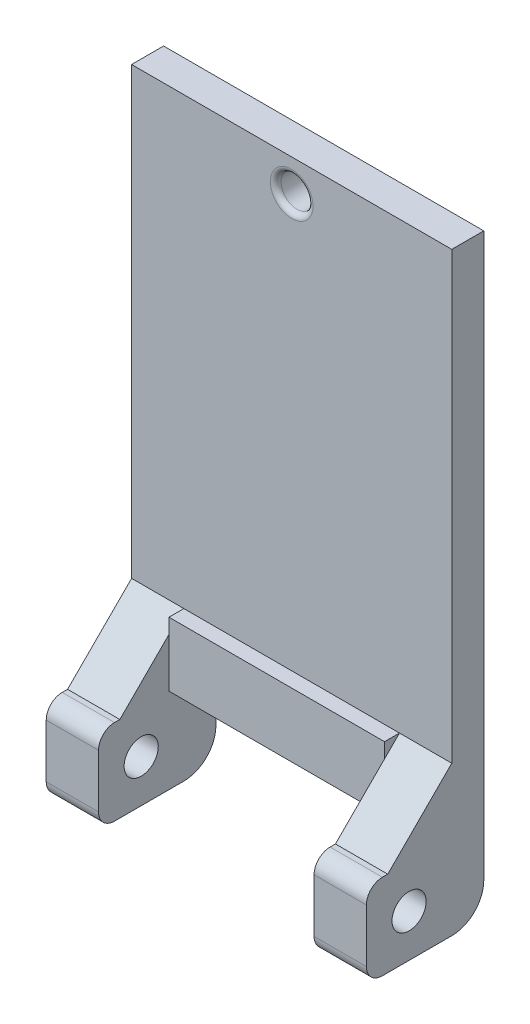
ISO-10303-21;
HEADER;
FILE_DESCRIPTION(('STEP AP214'),'2;1');
FILE_NAME('part.step','',(''),(''),'','','');
FILE_SCHEMA(('AUTOMOTIVE_DESIGN { 1 0 10303 214 1 1 1 1 }'));
ENDSEC;
DATA;
#1=APPLICATION_CONTEXT('core data for automotive mechanical design processes');
#2=APPLICATION_PROTOCOL_DEFINITION('international standard','automotive_design',2000,#1);
#3=PRODUCT_CONTEXT('',#1,'mechanical');
#4=PRODUCT('Part','Part','',(#3));
#5=PRODUCT_RELATED_PRODUCT_CATEGORY('part','',(#4));
#6=PRODUCT_DEFINITION_FORMATION('','',#4);
#7=PRODUCT_DEFINITION_CONTEXT('part definition',#1,'design');
#8=PRODUCT_DEFINITION('design','',#6,#7);
#9=PRODUCT_DEFINITION_SHAPE('','',#8);
#10=(LENGTH_UNIT() NAMED_UNIT(*) SI_UNIT(.MILLI.,.METRE.));
#11=(NAMED_UNIT(*) PLANE_ANGLE_UNIT() SI_UNIT($,.RADIAN.));
#12=(NAMED_UNIT(*) SI_UNIT($,.STERADIAN.) SOLID_ANGLE_UNIT());
#13=UNCERTAINTY_MEASURE_WITH_UNIT(LENGTH_MEASURE(1.E-05),#10,'distance_accuracy_value','');
#14=(GEOMETRIC_REPRESENTATION_CONTEXT(3) GLOBAL_UNCERTAINTY_ASSIGNED_CONTEXT((#13)) GLOBAL_UNIT_ASSIGNED_CONTEXT((#10,
#11,#12)) REPRESENTATION_CONTEXT('',''));
#15=CARTESIAN_POINT('',(0.,0.,0.));
#16=DIRECTION('',(0.,0.,1.));
#17=DIRECTION('',(1.,0.,0.));
#18=AXIS2_PLACEMENT_3D('',#15,#16,#17);
#19=CARTESIAN_POINT('',(0.,0.,3.));
#20=DIRECTION('',(0.,0.,-1.));
#21=DIRECTION('',(-1.,0.,0.));
#22=AXIS2_PLACEMENT_3D('',#19,#20,#21);
#23=PLANE('',#22);
#24=CARTESIAN_POINT('',(0.,24.85,3.));
#25=DIRECTION('',(0.,0.,-1.));
#26=DIRECTION('',(-1.,0.,0.));
#27=AXIS2_PLACEMENT_3D('',#24,#25,#26);
#28=CIRCLE('',#27,2.);
#29=CARTESIAN_POINT('',(-2.,24.85,3.));
#30=VERTEX_POINT('',#29);
#31=EDGE_CURVE('E295',#30,#30,#28,.T.);
#32=ORIENTED_EDGE('',*,*,#31,.T.);
#33=EDGE_LOOP('',(#32));
#34=FACE_BOUND('',#33,.T.);
#35=DIRECTION('',(-1.,0.,0.));
#36=VECTOR('',#35,1.);
#37=CARTESIAN_POINT('',(-10.1,-13.85,3.));
#38=LINE('',#37,#36);
#39=CARTESIAN_POINT('',(10.1,-13.85,3.));
#40=VERTEX_POINT('',#39);
#41=CARTESIAN_POINT('',(-10.1,-13.85,3.));
#42=VERTEX_POINT('',#41);
#43=EDGE_CURVE('E209',#40,#42,#38,.T.);
#44=ORIENTED_EDGE('',*,*,#43,.F.);
#45=DIRECTION('',(1.,0.,0.));
#46=VECTOR('',#45,1.);
#47=CARTESIAN_POINT('',(0.,-13.85,3.));
#48=LINE('',#47,#46);
#49=CARTESIAN_POINT('',(15.,-13.85,3.));
#50=VERTEX_POINT('',#49);
#51=EDGE_CURVE('E358',#40,#50,#48,.T.);
#52=ORIENTED_EDGE('',*,*,#51,.T.);
#53=DIRECTION('',(0.,1.,0.));
#54=VECTOR('',#53,1.);
#55=CARTESIAN_POINT('',(15.,-27.85,3.));
#56=LINE('',#55,#54);
#57=CARTESIAN_POINT('',(15.,27.85,3.));
#58=VERTEX_POINT('',#57);
#59=EDGE_CURVE('E259',#50,#58,#56,.T.);
#60=ORIENTED_EDGE('',*,*,#59,.T.);
#61=DIRECTION('',(-1.,0.,0.));
#62=VECTOR('',#61,1.);
#63=CARTESIAN_POINT('',(-15.,27.85,3.));
#64=LINE('',#63,#62);
#65=CARTESIAN_POINT('',(-15.,27.85,3.));
#66=VERTEX_POINT('',#65);
#67=EDGE_CURVE('E261',#58,#66,#64,.T.);
#68=ORIENTED_EDGE('',*,*,#67,.T.);
#69=DIRECTION('',(0.,-1.,0.));
#70=VECTOR('',#69,1.);
#71=CARTESIAN_POINT('',(-15.,-27.85,3.));
#72=LINE('',#71,#70);
#73=CARTESIAN_POINT('',(-15.,-13.85,3.));
#74=VERTEX_POINT('',#73);
#75=EDGE_CURVE('E264',#66,#74,#72,.T.);
#76=ORIENTED_EDGE('',*,*,#75,.T.);
#77=DIRECTION('',(1.,0.,0.));
#78=VECTOR('',#77,1.);
#79=CARTESIAN_POINT('',(-10.1,-13.85,3.));
#80=LINE('',#79,#78);
#81=EDGE_CURVE('E361',#74,#42,#80,.T.);
#82=ORIENTED_EDGE('',*,*,#81,.T.);
#83=EDGE_LOOP('',(#44,#52,#60,#68,#76,#82));
#84=FACE_BOUND('',#83,.T.);
#85=ADVANCED_FACE('F32',(#34,#84),#23,.F.);
#86=CARTESIAN_POINT('',(-10.1,-27.85,11.));
#87=DIRECTION('',(-1.,0.,0.));
#88=DIRECTION('',(0.,-1.,0.));
#89=AXIS2_PLACEMENT_3D('',#86,#87,#88);
#90=PLANE('',#89);
#91=CARTESIAN_POINT('',(-10.1,-23.85,7.));
#92=DIRECTION('',(-1.,0.,0.));
#93=DIRECTION('',(0.,-1.,0.));
#94=AXIS2_PLACEMENT_3D('',#91,#92,#93);
#95=CIRCLE('',#94,1.6);
#96=CARTESIAN_POINT('',(-10.1,-25.45,7.));
#97=VERTEX_POINT('',#96);
#98=EDGE_CURVE('E243',#97,#97,#95,.T.);
#99=ORIENTED_EDGE('',*,*,#98,.T.);
#100=EDGE_LOOP('',(#99));
#101=FACE_BOUND('',#100,.T.);
#102=DIRECTION('',(0.,0.,-1.));
#103=VECTOR('',#102,1.);
#104=CARTESIAN_POINT('',(-10.1,-19.85,11.));
#105=LINE('',#104,#103);
#106=CARTESIAN_POINT('',(-10.1,-19.85,4.4));
#107=VERTEX_POINT('',#106);
#108=CARTESIAN_POINT('',(-10.1,-19.85,0.));
#109=VERTEX_POINT('',#108);
#110=EDGE_CURVE('E47',#107,#109,#105,.T.);
#111=ORIENTED_EDGE('',*,*,#110,.F.);
#112=DIRECTION('',(0.,-1.,0.));
#113=VECTOR('',#112,1.);
#114=CARTESIAN_POINT('',(-10.1,-13.85,4.4));
#115=LINE('',#114,#113);
#116=CARTESIAN_POINT('',(-10.1,-15.25,4.4));
#117=VERTEX_POINT('',#116);
#118=EDGE_CURVE('E210',#117,#107,#115,.T.);
#119=ORIENTED_EDGE('',*,*,#118,.F.);
#120=DIRECTION('',(0.,0.707106781186544,-0.707106781186551));
#121=VECTOR('',#120,1.);
#122=CARTESIAN_POINT('',(-10.1,-24.8499999999999,14.));
#123=LINE('',#122,#121);
#124=CARTESIAN_POINT('',(-10.1,-19.85,9.00000000000004));
#125=VERTEX_POINT('',#124);
#126=EDGE_CURVE('E367',#117,#125,#123,.F.);
#127=ORIENTED_EDGE('',*,*,#126,.T.);
#128=DIRECTION('',(0.,0.,-1.));
#129=VECTOR('',#128,1.);
#130=CARTESIAN_POINT('',(-10.1,-19.85,11.));
#131=LINE('',#130,#129);
#132=CARTESIAN_POINT('',(-10.1,-19.85,9.5));
#133=VERTEX_POINT('',#132);
#134=EDGE_CURVE('E253',#133,#125,#131,.T.);
#135=ORIENTED_EDGE('',*,*,#134,.F.);
#136=CARTESIAN_POINT('',(-10.1,-21.35,9.5));
#137=DIRECTION('',(-1.,0.,0.));
#138=DIRECTION('',(0.,-1.,0.));
#139=AXIS2_PLACEMENT_3D('',#136,#137,#138);
#140=CIRCLE('',#139,1.5);
#141=CARTESIAN_POINT('',(-10.1,-21.35,11.));
#142=VERTEX_POINT('',#141);
#143=EDGE_CURVE('E343',#133,#142,#140,.F.);
#144=ORIENTED_EDGE('',*,*,#143,.T.);
#145=DIRECTION('',(0.,1.,0.));
#146=VECTOR('',#145,1.);
#147=CARTESIAN_POINT('',(-10.1,-27.85,11.));
#148=LINE('',#147,#146);
#149=CARTESIAN_POINT('',(-10.1,-26.35,11.));
#150=VERTEX_POINT('',#149);
#151=EDGE_CURVE('E247',#150,#142,#148,.T.);
#152=ORIENTED_EDGE('',*,*,#151,.F.);
#153=CARTESIAN_POINT('',(-10.1,-26.35,9.5));
#154=DIRECTION('',(-1.,0.,0.));
#155=DIRECTION('',(0.,-1.,0.));
#156=AXIS2_PLACEMENT_3D('',#153,#154,#155);
#157=CIRCLE('',#156,1.5);
#158=CARTESIAN_POINT('',(-10.1,-27.85,9.5));
#159=VERTEX_POINT('',#158);
#160=EDGE_CURVE('E345',#150,#159,#157,.F.);
#161=ORIENTED_EDGE('',*,*,#160,.T.);
#162=DIRECTION('',(0.,0.,-1.));
#163=VECTOR('',#162,1.);
#164=CARTESIAN_POINT('',(-10.1,-27.85,11.));
#165=LINE('',#164,#163);
#166=CARTESIAN_POINT('',(-10.1,-27.85,3.));
#167=VERTEX_POINT('',#166);
#168=EDGE_CURVE('E256',#159,#167,#165,.T.);
#169=ORIENTED_EDGE('',*,*,#168,.T.);
#170=CARTESIAN_POINT('',(-10.1,-24.85,3.));
#171=DIRECTION('',(1.,0.,0.));
#172=DIRECTION('',(0.,1.,0.));
#173=AXIS2_PLACEMENT_3D('',#170,#171,#172);
#174=CIRCLE('',#173,3.);
#175=CARTESIAN_POINT('',(-10.1,-24.85,0.));
#176=VERTEX_POINT('',#175);
#177=EDGE_CURVE('E316',#176,#167,#174,.F.);
#178=ORIENTED_EDGE('',*,*,#177,.F.);
#179=DIRECTION('',(0.,-1.,0.));
#180=VECTOR('',#179,1.);
#181=CARTESIAN_POINT('',(-10.1,0.,0.));
#182=LINE('',#181,#180);
#183=EDGE_CURVE('E217',#109,#176,#182,.T.);
#184=ORIENTED_EDGE('',*,*,#183,.F.);
#185=EDGE_LOOP('',(#111,#119,#127,#135,#144,#152,#161,#169,#178,#184));
#186=FACE_BOUND('',#185,.T.);
#187=ADVANCED_FACE('F447',(#101,#186),#90,.F.);
#188=CARTESIAN_POINT('',(10.1,-27.85,11.));
#189=DIRECTION('',(-1.,0.,0.));
#190=DIRECTION('',(0.,-1.,0.));
#191=AXIS2_PLACEMENT_3D('',#188,#189,#190);
#192=PLANE('',#191);
#193=CARTESIAN_POINT('',(10.1,-23.85,7.));
#194=DIRECTION('',(-1.,0.,0.));
#195=DIRECTION('',(0.,-1.,0.));
#196=AXIS2_PLACEMENT_3D('',#193,#194,#195);
#197=CIRCLE('',#196,1.6);
#198=CARTESIAN_POINT('',(10.1,-25.45,7.));
#199=VERTEX_POINT('',#198);
#200=EDGE_CURVE('E225',#199,#199,#197,.F.);
#201=ORIENTED_EDGE('',*,*,#200,.T.);
#202=EDGE_LOOP('',(#201));
#203=FACE_BOUND('',#202,.T.);
#204=DIRECTION('',(0.,1.,0.));
#205=VECTOR('',#204,1.);
#206=CARTESIAN_POINT('',(10.1,-19.85,4.4));
#207=LINE('',#206,#205);
#208=CARTESIAN_POINT('',(10.1,-19.85,4.4));
#209=VERTEX_POINT('',#208);
#210=CARTESIAN_POINT('',(10.1,-15.25,4.4));
#211=VERTEX_POINT('',#210);
#212=EDGE_CURVE('E190',#209,#211,#207,.T.);
#213=ORIENTED_EDGE('',*,*,#212,.F.);
#214=DIRECTION('',(0.,0.,-1.));
#215=VECTOR('',#214,1.);
#216=CARTESIAN_POINT('',(10.1,-19.85,11.));
#217=LINE('',#216,#215);
#218=CARTESIAN_POINT('',(10.1,-19.85,0.));
#219=VERTEX_POINT('',#218);
#220=EDGE_CURVE('E55',#209,#219,#217,.T.);
#221=ORIENTED_EDGE('',*,*,#220,.T.);
#222=DIRECTION('',(0.,1.,0.));
#223=VECTOR('',#222,1.);
#224=CARTESIAN_POINT('',(10.1,0.,0.));
#225=LINE('',#224,#223);
#226=CARTESIAN_POINT('',(10.1,-24.85,0.));
#227=VERTEX_POINT('',#226);
#228=EDGE_CURVE('E214',#227,#219,#225,.T.);
#229=ORIENTED_EDGE('',*,*,#228,.F.);
#230=CARTESIAN_POINT('',(10.1,-24.85,3.));
#231=DIRECTION('',(-1.,0.,0.));
#232=DIRECTION('',(0.,-1.,0.));
#233=AXIS2_PLACEMENT_3D('',#230,#231,#232);
#234=CIRCLE('',#233,3.);
#235=CARTESIAN_POINT('',(10.1,-27.85,3.));
#236=VERTEX_POINT('',#235);
#237=EDGE_CURVE('E313',#236,#227,#234,.F.);
#238=ORIENTED_EDGE('',*,*,#237,.F.);
#239=DIRECTION('',(0.,0.,-1.));
#240=VECTOR('',#239,1.);
#241=CARTESIAN_POINT('',(10.1,-27.85,11.));
#242=LINE('',#241,#240);
#243=CARTESIAN_POINT('',(10.1,-27.85,9.5));
#244=VERTEX_POINT('',#243);
#245=EDGE_CURVE('E232',#244,#236,#242,.T.);
#246=ORIENTED_EDGE('',*,*,#245,.F.);
#247=CARTESIAN_POINT('',(10.1,-26.35,9.5));
#248=DIRECTION('',(-1.,0.,0.));
#249=DIRECTION('',(0.,-1.,0.));
#250=AXIS2_PLACEMENT_3D('',#247,#248,#249);
#251=CIRCLE('',#250,1.5);
#252=CARTESIAN_POINT('',(10.1,-26.35,11.));
#253=VERTEX_POINT('',#252);
#254=EDGE_CURVE('E324',#244,#253,#251,.T.);
#255=ORIENTED_EDGE('',*,*,#254,.T.);
#256=DIRECTION('',(0.,1.,0.));
#257=VECTOR('',#256,1.);
#258=CARTESIAN_POINT('',(10.1,-27.85,11.));
#259=LINE('',#258,#257);
#260=CARTESIAN_POINT('',(10.1,-21.35,11.));
#261=VERTEX_POINT('',#260);
#262=EDGE_CURVE('E229',#253,#261,#259,.T.);
#263=ORIENTED_EDGE('',*,*,#262,.T.);
#264=CARTESIAN_POINT('',(10.1,-21.35,9.5));
#265=DIRECTION('',(-1.,0.,0.));
#266=DIRECTION('',(0.,-1.,0.));
#267=AXIS2_PLACEMENT_3D('',#264,#265,#266);
#268=CIRCLE('',#267,1.5);
#269=CARTESIAN_POINT('',(10.1,-19.85,9.5));
#270=VERTEX_POINT('',#269);
#271=EDGE_CURVE('E322',#261,#270,#268,.T.);
#272=ORIENTED_EDGE('',*,*,#271,.T.);
#273=DIRECTION('',(0.,0.,-1.));
#274=VECTOR('',#273,1.);
#275=CARTESIAN_POINT('',(10.1,-19.85,11.));
#276=LINE('',#275,#274);
#277=CARTESIAN_POINT('',(10.1,-19.85,8.99999999999997));
#278=VERTEX_POINT('',#277);
#279=EDGE_CURVE('E234',#270,#278,#276,.T.);
#280=ORIENTED_EDGE('',*,*,#279,.T.);
#281=DIRECTION('',(0.,0.707106781186551,-0.707106781186544));
#282=VECTOR('',#281,1.);
#283=CARTESIAN_POINT('',(10.1,-13.85,3.));
#284=LINE('',#283,#282);
#285=EDGE_CURVE('E11',#278,#211,#284,.T.);
#286=ORIENTED_EDGE('',*,*,#285,.T.);
#287=EDGE_LOOP('',(#213,#221,#229,#238,#246,#255,#263,#272,#280,#286));
#288=FACE_BOUND('',#287,.T.);
#289=ADVANCED_FACE('F384',(#203,#288),#192,.T.);
#290=CARTESIAN_POINT('',(0.,0.,0.));
#291=DIRECTION('',(0.,0.,-1.));
#292=DIRECTION('',(-1.,0.,0.));
#293=AXIS2_PLACEMENT_3D('',#290,#291,#292);
#294=PLANE('',#293);
#295=CARTESIAN_POINT('',(0.,24.85,0.));
#296=DIRECTION('',(0.,0.,-1.));
#297=DIRECTION('',(-1.,0.,0.));
#298=AXIS2_PLACEMENT_3D('',#295,#296,#297);
#299=CIRCLE('',#298,2.);
#300=CARTESIAN_POINT('',(-2.,24.85,0.));
#301=VERTEX_POINT('',#300);
#302=EDGE_CURVE('E292',#301,#301,#299,.F.);
#303=ORIENTED_EDGE('',*,*,#302,.T.);
#304=EDGE_LOOP('',(#303));
#305=FACE_BOUND('',#304,.T.);
#306=DIRECTION('',(1.,0.,0.));
#307=VECTOR('',#306,1.);
#308=CARTESIAN_POINT('',(0.,-19.85,0.));
#309=LINE('',#308,#307);
#310=EDGE_CURVE('E220',#109,#219,#309,.T.);
#311=ORIENTED_EDGE('',*,*,#310,.F.);
#312=ORIENTED_EDGE('',*,*,#183,.T.);
#313=DIRECTION('',(1.,0.,0.));
#314=VECTOR('',#313,1.);
#315=CARTESIAN_POINT('',(-15.,-24.85,0.));
#316=LINE('',#315,#314);
#317=CARTESIAN_POINT('',(-15.,-24.85,0.));
#318=VERTEX_POINT('',#317);
#319=EDGE_CURVE('E306',#176,#318,#316,.F.);
#320=ORIENTED_EDGE('',*,*,#319,.T.);
#321=DIRECTION('',(0.,-1.,0.));
#322=VECTOR('',#321,1.);
#323=CARTESIAN_POINT('',(-15.,-27.85,0.));
#324=LINE('',#323,#322);
#325=CARTESIAN_POINT('',(-15.,27.85,0.));
#326=VERTEX_POINT('',#325);
#327=EDGE_CURVE('E262',#326,#318,#324,.T.);
#328=ORIENTED_EDGE('',*,*,#327,.F.);
#329=DIRECTION('',(-1.,0.,0.));
#330=VECTOR('',#329,1.);
#331=CARTESIAN_POINT('',(-15.,27.85,0.));
#332=LINE('',#331,#330);
#333=CARTESIAN_POINT('',(15.,27.85,0.));
#334=VERTEX_POINT('',#333);
#335=EDGE_CURVE('E269',#334,#326,#332,.T.);
#336=ORIENTED_EDGE('',*,*,#335,.F.);
#337=DIRECTION('',(0.,1.,0.));
#338=VECTOR('',#337,1.);
#339=CARTESIAN_POINT('',(15.,-27.85,0.));
#340=LINE('',#339,#338);
#341=CARTESIAN_POINT('',(15.,-24.85,0.));
#342=VERTEX_POINT('',#341);
#343=EDGE_CURVE('E258',#342,#334,#340,.T.);
#344=ORIENTED_EDGE('',*,*,#343,.F.);
#345=EDGE_CURVE('E307',#342,#227,#316,.F.);
#346=ORIENTED_EDGE('',*,*,#345,.T.);
#347=ORIENTED_EDGE('',*,*,#228,.T.);
#348=EDGE_LOOP('',(#311,#312,#320,#328,#336,#344,#346,#347));
#349=FACE_BOUND('',#348,.T.);
#350=ADVANCED_FACE('F412',(#305,#349),#294,.T.);
#351=CARTESIAN_POINT('',(-15.,-24.85,3.));
#352=DIRECTION('',(-1.,0.,0.));
#353=DIRECTION('',(0.,0.,1.));
#354=AXIS2_PLACEMENT_3D('',#351,#352,#353);
#355=CYLINDRICAL_SURFACE('',#354,3.);
#356=ORIENTED_EDGE('',*,*,#319,.F.);
#357=ORIENTED_EDGE('',*,*,#177,.T.);
#358=DIRECTION('',(1.,0.,0.));
#359=VECTOR('',#358,1.);
#360=CARTESIAN_POINT('',(15.,-27.85,3.));
#361=LINE('',#360,#359);
#362=CARTESIAN_POINT('',(-15.,-27.85,3.));
#363=VERTEX_POINT('',#362);
#364=EDGE_CURVE('E301',#363,#167,#361,.T.);
#365=ORIENTED_EDGE('',*,*,#364,.F.);
#366=CARTESIAN_POINT('',(-15.,-24.85,3.));
#367=DIRECTION('',(1.,0.,0.));
#368=DIRECTION('',(0.,0.,-1.));
#369=AXIS2_PLACEMENT_3D('',#366,#367,#368);
#370=CIRCLE('',#369,3.);
#371=EDGE_CURVE('E310',#318,#363,#370,.F.);
#372=ORIENTED_EDGE('',*,*,#371,.F.);
#373=EDGE_LOOP('',(#356,#357,#365,#372));
#374=FACE_BOUND('',#373,.T.);
#375=ADVANCED_FACE('F432',(#374),#355,.T.);
#376=DIRECTION('',(1.,0.,0.));
#377=VECTOR('',#376,1.);
#378=CARTESIAN_POINT('',(15.,-27.85,3.));
#379=LINE('',#378,#377);
#380=CARTESIAN_POINT('',(15.,-27.85,3.));
#381=VERTEX_POINT('',#380);
#382=EDGE_CURVE('E298',#236,#381,#379,.T.);
#383=ORIENTED_EDGE('',*,*,#382,.F.);
#384=ORIENTED_EDGE('',*,*,#237,.T.);
#385=ORIENTED_EDGE('',*,*,#345,.F.);
#386=CARTESIAN_POINT('',(15.,-24.85,3.));
#387=DIRECTION('',(-1.,0.,0.));
#388=DIRECTION('',(0.,0.,1.));
#389=AXIS2_PLACEMENT_3D('',#386,#387,#388);
#390=CIRCLE('',#389,3.);
#391=EDGE_CURVE('E304',#381,#342,#390,.F.);
#392=ORIENTED_EDGE('',*,*,#391,.F.);
#393=EDGE_LOOP('',(#383,#384,#385,#392));
#394=FACE_BOUND('',#393,.T.);
#395=ADVANCED_FACE('F407',(#394),#355,.T.);
#396=CARTESIAN_POINT('',(-15.,-27.85,3.));
#397=DIRECTION('',(0.,1.,0.));
#398=DIRECTION('',(0.,0.,1.));
#399=AXIS2_PLACEMENT_3D('',#396,#397,#398);
#400=PLANE('',#399);
#401=ORIENTED_EDGE('',*,*,#168,.F.);
#402=DIRECTION('',(1.,0.,0.));
#403=VECTOR('',#402,1.);
#404=CARTESIAN_POINT('',(-15.,-27.85,9.5));
#405=LINE('',#404,#403);
#406=CARTESIAN_POINT('',(-15.,-27.85,9.5));
#407=VERTEX_POINT('',#406);
#408=EDGE_CURVE('E347',#159,#407,#405,.F.);
#409=ORIENTED_EDGE('',*,*,#408,.T.);
#410=DIRECTION('',(0.,0.,-1.));
#411=VECTOR('',#410,1.);
#412=CARTESIAN_POINT('',(-15.,-27.85,3.));
#413=LINE('',#412,#411);
#414=EDGE_CURVE('E274',#407,#363,#413,.T.);
#415=ORIENTED_EDGE('',*,*,#414,.T.);
#416=ORIENTED_EDGE('',*,*,#364,.T.);
#417=EDGE_LOOP('',(#401,#409,#415,#416));
#418=FACE_BOUND('',#417,.T.);
#419=ADVANCED_FACE('F461',(#418),#400,.F.);
#420=CARTESIAN_POINT('',(15.,-27.85,3.));
#421=DIRECTION('',(-1.,0.,0.));
#422=DIRECTION('',(0.,0.,1.));
#423=AXIS2_PLACEMENT_3D('',#420,#421,#422);
#424=PLANE('',#423);
#425=CARTESIAN_POINT('',(15.,-23.85,7.));
#426=DIRECTION('',(-1.,0.,0.));
#427=DIRECTION('',(0.,0.,1.));
#428=AXIS2_PLACEMENT_3D('',#425,#426,#427);
#429=CIRCLE('',#428,1.6);
#430=CARTESIAN_POINT('',(15.,-23.85,8.6));
#431=VERTEX_POINT('',#430);
#432=EDGE_CURVE('E222',#431,#431,#429,.T.);
#433=ORIENTED_EDGE('',*,*,#432,.T.);
#434=EDGE_LOOP('',(#433));
#435=FACE_BOUND('',#434,.T.);
#436=DIRECTION('',(0.,-1.,0.));
#437=VECTOR('',#436,1.);
#438=CARTESIAN_POINT('',(15.,-27.85,11.));
#439=LINE('',#438,#437);
#440=CARTESIAN_POINT('',(15.,-21.35,11.));
#441=VERTEX_POINT('',#440);
#442=CARTESIAN_POINT('',(15.,-26.35,11.));
#443=VERTEX_POINT('',#442);
#444=EDGE_CURVE('E226',#441,#443,#439,.T.);
#445=ORIENTED_EDGE('',*,*,#444,.T.);
#446=CARTESIAN_POINT('',(15.,-26.35,9.5));
#447=DIRECTION('',(-1.,0.,0.));
#448=DIRECTION('',(0.,0.,1.));
#449=AXIS2_PLACEMENT_3D('',#446,#447,#448);
#450=CIRCLE('',#449,1.5);
#451=CARTESIAN_POINT('',(15.,-27.85,9.5));
#452=VERTEX_POINT('',#451);
#453=EDGE_CURVE('E332',#443,#452,#450,.F.);
#454=ORIENTED_EDGE('',*,*,#453,.T.);
#455=DIRECTION('',(0.,0.,-1.));
#456=VECTOR('',#455,1.);
#457=CARTESIAN_POINT('',(15.,-27.85,3.));
#458=LINE('',#457,#456);
#459=EDGE_CURVE('E267',#452,#381,#458,.T.);
#460=ORIENTED_EDGE('',*,*,#459,.T.);
#461=ORIENTED_EDGE('',*,*,#391,.T.);
#462=ORIENTED_EDGE('',*,*,#343,.T.);
#463=DIRECTION('',(0.,0.,-1.));
#464=VECTOR('',#463,1.);
#465=CARTESIAN_POINT('',(15.,27.85,3.));
#466=LINE('',#465,#464);
#467=EDGE_CURVE('E279',#58,#334,#466,.T.);
#468=ORIENTED_EDGE('',*,*,#467,.F.);
#469=ORIENTED_EDGE('',*,*,#59,.F.);
#470=DIRECTION('',(0.,-0.707106781186551,0.707106781186544));
#471=VECTOR('',#470,1.);
#472=CARTESIAN_POINT('',(15.,-20.8500000000001,10.));
#473=LINE('',#472,#471);
#474=CARTESIAN_POINT('',(15.,-19.85,8.99999999999997));
#475=VERTEX_POINT('',#474);
#476=EDGE_CURVE('E370',#50,#475,#473,.T.);
#477=ORIENTED_EDGE('',*,*,#476,.T.);
#478=DIRECTION('',(0.,0.,-1.));
#479=VECTOR('',#478,1.);
#480=CARTESIAN_POINT('',(15.,-19.85,11.));
#481=LINE('',#480,#479);
#482=CARTESIAN_POINT('',(15.,-19.85,9.5));
#483=VERTEX_POINT('',#482);
#484=EDGE_CURVE('E237',#483,#475,#481,.T.);
#485=ORIENTED_EDGE('',*,*,#484,.F.);
#486=CARTESIAN_POINT('',(15.,-21.35,9.5));
#487=DIRECTION('',(-1.,0.,0.));
#488=DIRECTION('',(0.,0.,1.));
#489=AXIS2_PLACEMENT_3D('',#486,#487,#488);
#490=CIRCLE('',#489,1.5);
#491=EDGE_CURVE('E330',#483,#441,#490,.F.);
#492=ORIENTED_EDGE('',*,*,#491,.T.);
#493=EDGE_LOOP('',(#445,#454,#460,#461,#462,#468,#469,#477,#485,#492));
#494=FACE_BOUND('',#493,.T.);
#495=ADVANCED_FACE('F374',(#435,#494),#424,.F.);
#496=CARTESIAN_POINT('',(-15.,27.85,3.));
#497=DIRECTION('',(0.,-1.,0.));
#498=DIRECTION('',(0.,0.,-1.));
#499=AXIS2_PLACEMENT_3D('',#496,#497,#498);
#500=PLANE('',#499);
#501=ORIENTED_EDGE('',*,*,#335,.T.);
#502=DIRECTION('',(0.,0.,-1.));
#503=VECTOR('',#502,1.);
#504=CARTESIAN_POINT('',(-15.,27.85,3.));
#505=LINE('',#504,#503);
#506=EDGE_CURVE('E276',#66,#326,#505,.T.);
#507=ORIENTED_EDGE('',*,*,#506,.F.);
#508=ORIENTED_EDGE('',*,*,#67,.F.);
#509=ORIENTED_EDGE('',*,*,#467,.T.);
#510=EDGE_LOOP('',(#501,#507,#508,#509));
#511=FACE_BOUND('',#510,.T.);
#512=ADVANCED_FACE('F417',(#511),#500,.F.);
#513=CARTESIAN_POINT('',(-15.,-27.85,3.));
#514=DIRECTION('',(1.,0.,0.));
#515=DIRECTION('',(0.,0.,-1.));
#516=AXIS2_PLACEMENT_3D('',#513,#514,#515);
#517=PLANE('',#516);
#518=CARTESIAN_POINT('',(-15.,-23.85,7.));
#519=DIRECTION('',(-1.,0.,0.));
#520=DIRECTION('',(0.,0.,1.));
#521=AXIS2_PLACEMENT_3D('',#518,#519,#520);
#522=CIRCLE('',#521,1.6);
#523=CARTESIAN_POINT('',(-15.,-23.85,8.6));
#524=VERTEX_POINT('',#523);
#525=EDGE_CURVE('E240',#524,#524,#522,.T.);
#526=ORIENTED_EDGE('',*,*,#525,.F.);
#527=EDGE_LOOP('',(#526));
#528=FACE_BOUND('',#527,.T.);
#529=ORIENTED_EDGE('',*,*,#414,.F.);
#530=CARTESIAN_POINT('',(-15.,-26.35,9.5));
#531=DIRECTION('',(1.,0.,0.));
#532=DIRECTION('',(0.,0.,-1.));
#533=AXIS2_PLACEMENT_3D('',#530,#531,#532);
#534=CIRCLE('',#533,1.5);
#535=CARTESIAN_POINT('',(-15.,-26.35,11.));
#536=VERTEX_POINT('',#535);
#537=EDGE_CURVE('E351',#407,#536,#534,.F.);
#538=ORIENTED_EDGE('',*,*,#537,.T.);
#539=DIRECTION('',(0.,-1.,0.));
#540=VECTOR('',#539,1.);
#541=CARTESIAN_POINT('',(-15.,-27.85,11.));
#542=LINE('',#541,#540);
#543=CARTESIAN_POINT('',(-15.,-21.35,11.));
#544=VERTEX_POINT('',#543);
#545=EDGE_CURVE('E244',#544,#536,#542,.T.);
#546=ORIENTED_EDGE('',*,*,#545,.F.);
#547=CARTESIAN_POINT('',(-15.,-21.35,9.5));
#548=DIRECTION('',(1.,0.,0.));
#549=DIRECTION('',(0.,0.,-1.));
#550=AXIS2_PLACEMENT_3D('',#547,#548,#549);
#551=CIRCLE('',#550,1.5);
#552=CARTESIAN_POINT('',(-15.,-19.85,9.5));
#553=VERTEX_POINT('',#552);
#554=EDGE_CURVE('E349',#544,#553,#551,.F.);
#555=ORIENTED_EDGE('',*,*,#554,.T.);
#556=DIRECTION('',(0.,0.,-1.));
#557=VECTOR('',#556,1.);
#558=CARTESIAN_POINT('',(-15.,-19.85,11.));
#559=LINE('',#558,#557);
#560=CARTESIAN_POINT('',(-15.,-19.85,9.00000000000004));
#561=VERTEX_POINT('',#560);
#562=EDGE_CURVE('E250',#553,#561,#559,.T.);
#563=ORIENTED_EDGE('',*,*,#562,.T.);
#564=DIRECTION('',(0.,-0.707106781186544,0.707106781186551));
#565=VECTOR('',#564,1.);
#566=CARTESIAN_POINT('',(-15.,-20.8499999999999,9.99999999999999));
#567=LINE('',#566,#565);
#568=EDGE_CURVE('E365',#561,#74,#567,.F.);
#569=ORIENTED_EDGE('',*,*,#568,.T.);
#570=ORIENTED_EDGE('',*,*,#75,.F.);
#571=ORIENTED_EDGE('',*,*,#506,.T.);
#572=ORIENTED_EDGE('',*,*,#327,.T.);
#573=ORIENTED_EDGE('',*,*,#371,.T.);
#574=EDGE_LOOP('',(#529,#538,#546,#555,#563,#569,#570,#571,#572,#573));
#575=FACE_BOUND('',#574,.T.);
#576=ADVANCED_FACE('F436',(#528,#575),#517,.F.);
#577=ORIENTED_EDGE('',*,*,#459,.F.);
#578=DIRECTION('',(-1.,0.,0.));
#579=VECTOR('',#578,1.);
#580=CARTESIAN_POINT('',(-15.,-27.85,9.5));
#581=LINE('',#580,#579);
#582=EDGE_CURVE('E319',#452,#244,#581,.T.);
#583=ORIENTED_EDGE('',*,*,#582,.T.);
#584=ORIENTED_EDGE('',*,*,#245,.T.);
#585=ORIENTED_EDGE('',*,*,#382,.T.);
#586=EDGE_LOOP('',(#577,#583,#584,#585));
#587=FACE_BOUND('',#586,.T.);
#588=ADVANCED_FACE('F400',(#587),#400,.F.);
#589=CARTESIAN_POINT('',(-15.,-19.85,11.));
#590=DIRECTION('',(0.,-1.,0.));
#591=DIRECTION('',(0.,0.,-1.));
#592=AXIS2_PLACEMENT_3D('',#589,#590,#591);
#593=PLANE('',#592);
#594=ORIENTED_EDGE('',*,*,#134,.T.);
#595=DIRECTION('',(-1.,0.,0.));
#596=VECTOR('',#595,1.);
#597=CARTESIAN_POINT('',(-15.,-19.85,9.00000000000004));
#598=LINE('',#597,#596);
#599=EDGE_CURVE('E355',#125,#561,#598,.T.);
#600=ORIENTED_EDGE('',*,*,#599,.T.);
#601=ORIENTED_EDGE('',*,*,#562,.F.);
#602=DIRECTION('',(-1.,0.,0.));
#603=VECTOR('',#602,1.);
#604=CARTESIAN_POINT('',(-15.,-19.85,9.5));
#605=LINE('',#604,#603);
#606=EDGE_CURVE('E353',#553,#133,#605,.F.);
#607=ORIENTED_EDGE('',*,*,#606,.T.);
#608=EDGE_LOOP('',(#594,#600,#601,#607));
#609=FACE_BOUND('',#608,.T.);
#610=ADVANCED_FACE('F443',(#609),#593,.F.);
#611=CARTESIAN_POINT('',(0.,0.,11.));
#612=DIRECTION('',(0.,0.,-1.));
#613=DIRECTION('',(-1.,0.,0.));
#614=AXIS2_PLACEMENT_3D('',#611,#612,#613);
#615=PLANE('',#614);
#616=ORIENTED_EDGE('',*,*,#545,.T.);
#617=DIRECTION('',(1.,0.,0.));
#618=VECTOR('',#617,1.);
#619=CARTESIAN_POINT('',(0.,-26.35,11.));
#620=LINE('',#619,#618);
#621=EDGE_CURVE('E340',#536,#150,#620,.T.);
#622=ORIENTED_EDGE('',*,*,#621,.T.);
#623=ORIENTED_EDGE('',*,*,#151,.T.);
#624=DIRECTION('',(-1.,0.,0.));
#625=VECTOR('',#624,1.);
#626=CARTESIAN_POINT('',(0.,-21.35,11.));
#627=LINE('',#626,#625);
#628=EDGE_CURVE('E337',#142,#544,#627,.T.);
#629=ORIENTED_EDGE('',*,*,#628,.T.);
#630=EDGE_LOOP('',(#616,#622,#623,#629));
#631=FACE_BOUND('',#630,.T.);
#632=ADVANCED_FACE('F454',(#631),#615,.F.);
#633=CARTESIAN_POINT('',(15.,-23.85,7.));
#634=DIRECTION('',(-1.,0.,0.));
#635=DIRECTION('',(0.,0.,1.));
#636=AXIS2_PLACEMENT_3D('',#633,#634,#635);
#637=CYLINDRICAL_SURFACE('',#636,1.6);
#638=ORIENTED_EDGE('',*,*,#525,.T.);
#639=EDGE_LOOP('',(#638));
#640=FACE_BOUND('',#639,.T.);
#641=ORIENTED_EDGE('',*,*,#98,.F.);
#642=EDGE_LOOP('',(#641));
#643=FACE_BOUND('',#642,.T.);
#644=ADVANCED_FACE('F544',(#640,#643),#637,.F.);
#645=CARTESIAN_POINT('',(15.,-19.85,11.));
#646=DIRECTION('',(0.,1.,0.));
#647=DIRECTION('',(0.,0.,1.));
#648=AXIS2_PLACEMENT_3D('',#645,#646,#647);
#649=PLANE('',#648);
#650=ORIENTED_EDGE('',*,*,#484,.T.);
#651=DIRECTION('',(-1.,0.,0.));
#652=VECTOR('',#651,1.);
#653=CARTESIAN_POINT('',(15.,-19.85,8.99999999999997));
#654=LINE('',#653,#652);
#655=EDGE_CURVE('E363',#475,#278,#654,.T.);
#656=ORIENTED_EDGE('',*,*,#655,.T.);
#657=ORIENTED_EDGE('',*,*,#279,.F.);
#658=DIRECTION('',(1.,0.,0.));
#659=VECTOR('',#658,1.);
#660=CARTESIAN_POINT('',(15.,-19.85,9.5));
#661=LINE('',#660,#659);
#662=EDGE_CURVE('E334',#270,#483,#661,.T.);
#663=ORIENTED_EDGE('',*,*,#662,.T.);
#664=EDGE_LOOP('',(#650,#656,#657,#663));
#665=FACE_BOUND('',#664,.T.);
#666=ADVANCED_FACE('F379',(#665),#649,.T.);
#667=CARTESIAN_POINT('',(0.,0.,11.));
#668=DIRECTION('',(0.,0.,-1.));
#669=DIRECTION('',(1.,0.,0.));
#670=AXIS2_PLACEMENT_3D('',#667,#668,#669);
#671=PLANE('',#670);
#672=ORIENTED_EDGE('',*,*,#262,.F.);
#673=DIRECTION('',(-1.,0.,0.));
#674=VECTOR('',#673,1.);
#675=CARTESIAN_POINT('',(0.,-26.35,11.));
#676=LINE('',#675,#674);
#677=EDGE_CURVE('E328',#253,#443,#676,.F.);
#678=ORIENTED_EDGE('',*,*,#677,.T.);
#679=ORIENTED_EDGE('',*,*,#444,.F.);
#680=DIRECTION('',(1.,0.,0.));
#681=VECTOR('',#680,1.);
#682=CARTESIAN_POINT('',(10.1,-21.35,11.));
#683=LINE('',#682,#681);
#684=EDGE_CURVE('E326',#441,#261,#683,.F.);
#685=ORIENTED_EDGE('',*,*,#684,.T.);
#686=EDGE_LOOP('',(#672,#678,#679,#685));
#687=FACE_BOUND('',#686,.T.);
#688=ADVANCED_FACE('F393',(#687),#671,.F.);
#689=CARTESIAN_POINT('',(-15.,-23.85,7.));
#690=DIRECTION('',(1.,0.,0.));
#691=DIRECTION('',(0.,0.,-1.));
#692=AXIS2_PLACEMENT_3D('',#689,#690,#691);
#693=CYLINDRICAL_SURFACE('',#692,1.6);
#694=ORIENTED_EDGE('',*,*,#200,.F.);
#695=EDGE_LOOP('',(#694));
#696=FACE_BOUND('',#695,.T.);
#697=ORIENTED_EDGE('',*,*,#432,.F.);
#698=EDGE_LOOP('',(#697));
#699=FACE_BOUND('',#698,.T.);
#700=ADVANCED_FACE('F503',(#696,#699),#693,.F.);
#701=CARTESIAN_POINT('',(0.,24.85,-7.));
#702=DIRECTION('',(0.,0.,1.));
#703=DIRECTION('',(1.,0.,0.));
#704=AXIS2_PLACEMENT_3D('',#701,#702,#703);
#705=CYLINDRICAL_SURFACE('',#704,1.5);
#706=CARTESIAN_POINT('',(0.,24.85,0.5));
#707=DIRECTION('',(0.,0.,-1.));
#708=DIRECTION('',(-1.,0.,0.));
#709=AXIS2_PLACEMENT_3D('',#706,#707,#708);
#710=CIRCLE('',#709,1.5);
#711=CARTESIAN_POINT('',(-1.5,24.85,0.5));
#712=VERTEX_POINT('',#711);
#713=EDGE_CURVE('E289',#712,#712,#710,.T.);
#714=ORIENTED_EDGE('',*,*,#713,.T.);
#715=EDGE_LOOP('',(#714));
#716=FACE_BOUND('',#715,.T.);
#717=CARTESIAN_POINT('',(0.,24.85,2.5));
#718=DIRECTION('',(0.,0.,-1.));
#719=DIRECTION('',(-1.,0.,0.));
#720=AXIS2_PLACEMENT_3D('',#717,#718,#719);
#721=CIRCLE('',#720,1.5);
#722=CARTESIAN_POINT('',(-1.5,24.85,2.5));
#723=VERTEX_POINT('',#722);
#724=EDGE_CURVE('E282',#723,#723,#721,.F.);
#725=ORIENTED_EDGE('',*,*,#724,.T.);
#726=EDGE_LOOP('',(#725));
#727=FACE_BOUND('',#726,.T.);
#728=ADVANCED_FACE('F497',(#716,#727),#705,.F.);
#729=CARTESIAN_POINT('',(0.,24.85,0.5));
#730=DIRECTION('',(0.,0.,-1.));
#731=DIRECTION('',(-1.,0.,0.));
#732=AXIS2_PLACEMENT_3D('',#729,#730,#731);
#733=TOROIDAL_SURFACE('',#732,2.,0.5);
#734=ORIENTED_EDGE('',*,*,#302,.F.);
#735=EDGE_LOOP('',(#734));
#736=FACE_BOUND('',#735,.T.);
#737=ORIENTED_EDGE('',*,*,#713,.F.);
#738=EDGE_LOOP('',(#737));
#739=FACE_BOUND('',#738,.T.);
#740=ADVANCED_FACE('F493',(#736,#739),#733,.T.);
#741=CARTESIAN_POINT('',(0.,24.85,2.5));
#742=DIRECTION('',(0.,0.,-1.));
#743=DIRECTION('',(-1.,0.,0.));
#744=AXIS2_PLACEMENT_3D('',#741,#742,#743);
#745=TOROIDAL_SURFACE('',#744,2.,0.5);
#746=ORIENTED_EDGE('',*,*,#31,.F.);
#747=EDGE_LOOP('',(#746));
#748=FACE_BOUND('',#747,.T.);
#749=ORIENTED_EDGE('',*,*,#724,.F.);
#750=EDGE_LOOP('',(#749));
#751=FACE_BOUND('',#750,.T.);
#752=ADVANCED_FACE('F496',(#748,#751),#745,.T.);
#753=CARTESIAN_POINT('',(0.,-19.85,11.));
#754=DIRECTION('',(0.,1.,0.));
#755=DIRECTION('',(0.,0.,1.));
#756=AXIS2_PLACEMENT_3D('',#753,#754,#755);
#757=PLANE('',#756);
#758=ORIENTED_EDGE('',*,*,#110,.T.);
#759=ORIENTED_EDGE('',*,*,#310,.T.);
#760=ORIENTED_EDGE('',*,*,#220,.F.);
#761=DIRECTION('',(1.,0.,0.));
#762=VECTOR('',#761,1.);
#763=CARTESIAN_POINT('',(-10.1,-19.85,4.4));
#764=LINE('',#763,#762);
#765=EDGE_CURVE('E193',#107,#209,#764,.T.);
#766=ORIENTED_EDGE('',*,*,#765,.F.);
#767=EDGE_LOOP('',(#758,#759,#760,#766));
#768=FACE_BOUND('',#767,.T.);
#769=ADVANCED_FACE('F428',(#768),#757,.F.);
#770=CARTESIAN_POINT('',(-15.,-26.35,9.5));
#771=DIRECTION('',(-1.,0.,0.));
#772=DIRECTION('',(0.,0.,1.));
#773=AXIS2_PLACEMENT_3D('',#770,#771,#772);
#774=CYLINDRICAL_SURFACE('',#773,1.5);
#775=ORIENTED_EDGE('',*,*,#453,.F.);
#776=ORIENTED_EDGE('',*,*,#677,.F.);
#777=ORIENTED_EDGE('',*,*,#254,.F.);
#778=ORIENTED_EDGE('',*,*,#582,.F.);
#779=EDGE_LOOP('',(#775,#776,#777,#778));
#780=FACE_BOUND('',#779,.T.);
#781=ADVANCED_FACE('F396',(#780),#774,.T.);
#782=CARTESIAN_POINT('',(15.,-21.35,9.5));
#783=DIRECTION('',(-1.,0.,0.));
#784=DIRECTION('',(0.,0.,1.));
#785=AXIS2_PLACEMENT_3D('',#782,#783,#784);
#786=CYLINDRICAL_SURFACE('',#785,1.5);
#787=ORIENTED_EDGE('',*,*,#271,.F.);
#788=ORIENTED_EDGE('',*,*,#684,.F.);
#789=ORIENTED_EDGE('',*,*,#491,.F.);
#790=ORIENTED_EDGE('',*,*,#662,.F.);
#791=EDGE_LOOP('',(#787,#788,#789,#790));
#792=FACE_BOUND('',#791,.T.);
#793=ADVANCED_FACE('F387',(#792),#786,.T.);
#794=CARTESIAN_POINT('',(0.,-26.35,9.5));
#795=DIRECTION('',(1.,0.,0.));
#796=DIRECTION('',(0.,0.,-1.));
#797=AXIS2_PLACEMENT_3D('',#794,#795,#796);
#798=CYLINDRICAL_SURFACE('',#797,1.5);
#799=ORIENTED_EDGE('',*,*,#537,.F.);
#800=ORIENTED_EDGE('',*,*,#408,.F.);
#801=ORIENTED_EDGE('',*,*,#160,.F.);
#802=ORIENTED_EDGE('',*,*,#621,.F.);
#803=EDGE_LOOP('',(#799,#800,#801,#802));
#804=FACE_BOUND('',#803,.T.);
#805=ADVANCED_FACE('F458',(#804),#798,.T.);
#806=CARTESIAN_POINT('',(0.,-21.35,9.5));
#807=DIRECTION('',(-1.,0.,0.));
#808=DIRECTION('',(0.,0.,1.));
#809=AXIS2_PLACEMENT_3D('',#806,#807,#808);
#810=CYLINDRICAL_SURFACE('',#809,1.5);
#811=ORIENTED_EDGE('',*,*,#143,.F.);
#812=ORIENTED_EDGE('',*,*,#606,.F.);
#813=ORIENTED_EDGE('',*,*,#554,.F.);
#814=ORIENTED_EDGE('',*,*,#628,.F.);
#815=EDGE_LOOP('',(#811,#812,#813,#814));
#816=FACE_BOUND('',#815,.T.);
#817=ADVANCED_FACE('F451',(#816),#810,.T.);
#818=CARTESIAN_POINT('',(-15.,-19.85,9.00000000000004));
#819=DIRECTION('',(0.,0.707106781186551,0.707106781186544));
#820=DIRECTION('',(1.,0.,0.));
#821=AXIS2_PLACEMENT_3D('',#818,#819,#820);
#822=PLANE('',#821);
#823=EDGE_CURVE('E368',#42,#117,#123,.F.);
#824=ORIENTED_EDGE('',*,*,#823,.F.);
#825=ORIENTED_EDGE('',*,*,#81,.F.);
#826=ORIENTED_EDGE('',*,*,#568,.F.);
#827=ORIENTED_EDGE('',*,*,#599,.F.);
#828=ORIENTED_EDGE('',*,*,#126,.F.);
#829=EDGE_LOOP('',(#824,#825,#826,#827,#828));
#830=FACE_BOUND('',#829,.T.);
#831=ADVANCED_FACE('F441',(#830),#822,.T.);
#832=CARTESIAN_POINT('',(0.,-13.85,3.));
#833=DIRECTION('',(0.,-0.707106781186544,-0.707106781186551));
#834=DIRECTION('',(1.,0.,0.));
#835=AXIS2_PLACEMENT_3D('',#832,#833,#834);
#836=PLANE('',#835);
#837=ORIENTED_EDGE('',*,*,#285,.F.);
#838=ORIENTED_EDGE('',*,*,#655,.F.);
#839=ORIENTED_EDGE('',*,*,#476,.F.);
#840=ORIENTED_EDGE('',*,*,#51,.F.);
#841=EDGE_CURVE('E40',#211,#40,#284,.T.);
#842=ORIENTED_EDGE('',*,*,#841,.F.);
#843=EDGE_LOOP('',(#837,#838,#839,#840,#842));
#844=FACE_BOUND('',#843,.T.);
#845=ADVANCED_FACE('F34',(#844),#836,.F.);
#846=CARTESIAN_POINT('',(-10.1,-13.85,4.4));
#847=DIRECTION('',(1.,0.,0.));
#848=DIRECTION('',(0.,1.,0.));
#849=AXIS2_PLACEMENT_3D('',#846,#847,#848);
#850=PLANE('',#849);
#851=DIRECTION('',(0.,0.,-1.));
#852=VECTOR('',#851,1.);
#853=CARTESIAN_POINT('',(-10.1,-13.85,4.4));
#854=LINE('',#853,#852);
#855=CARTESIAN_POINT('',(-10.1,-13.85,4.4));
#856=VERTEX_POINT('',#855);
#857=EDGE_CURVE('E200',#856,#42,#854,.T.);
#858=ORIENTED_EDGE('',*,*,#857,.T.);
#859=ORIENTED_EDGE('',*,*,#823,.T.);
#860=EDGE_CURVE('E425',#856,#117,#115,.T.);
#861=ORIENTED_EDGE('',*,*,#860,.F.);
#862=EDGE_LOOP('',(#858,#859,#861));
#863=FACE_BOUND('',#862,.T.);
#864=ADVANCED_FACE('F424',(#863),#850,.F.);
#865=CARTESIAN_POINT('',(10.1,-19.85,4.4));
#866=DIRECTION('',(-1.,0.,0.));
#867=DIRECTION('',(0.,-1.,0.));
#868=AXIS2_PLACEMENT_3D('',#865,#866,#867);
#869=PLANE('',#868);
#870=CARTESIAN_POINT('',(10.1,-13.85,4.4));
#871=VERTEX_POINT('',#870);
#872=EDGE_CURVE('E182',#211,#871,#207,.T.);
#873=ORIENTED_EDGE('',*,*,#872,.F.);
#874=ORIENTED_EDGE('',*,*,#841,.T.);
#875=DIRECTION('',(0.,0.,-1.));
#876=VECTOR('',#875,1.);
#877=CARTESIAN_POINT('',(10.1,-13.85,4.4));
#878=LINE('',#877,#876);
#879=EDGE_CURVE('E196',#871,#40,#878,.T.);
#880=ORIENTED_EDGE('',*,*,#879,.F.);
#881=EDGE_LOOP('',(#873,#874,#880));
#882=FACE_BOUND('',#881,.T.);
#883=ADVANCED_FACE('F197',(#882),#869,.F.);
#884=CARTESIAN_POINT('',(-10.1,-13.85,4.4));
#885=DIRECTION('',(0.,-1.,0.));
#886=DIRECTION('',(1.,0.,0.));
#887=AXIS2_PLACEMENT_3D('',#884,#885,#886);
#888=PLANE('',#887);
#889=ORIENTED_EDGE('',*,*,#43,.T.);
#890=ORIENTED_EDGE('',*,*,#857,.F.);
#891=DIRECTION('',(-1.,0.,0.));
#892=VECTOR('',#891,1.);
#893=CARTESIAN_POINT('',(-10.1,-13.85,4.4));
#894=LINE('',#893,#892);
#895=EDGE_CURVE('E187',#871,#856,#894,.T.);
#896=ORIENTED_EDGE('',*,*,#895,.F.);
#897=ORIENTED_EDGE('',*,*,#879,.T.);
#898=EDGE_LOOP('',(#889,#890,#896,#897));
#899=FACE_BOUND('',#898,.T.);
#900=ADVANCED_FACE('F202',(#899),#888,.F.);
#901=CARTESIAN_POINT('',(0.,0.,4.4));
#902=DIRECTION('',(0.,0.,1.));
#903=DIRECTION('',(1.,0.,0.));
#904=AXIS2_PLACEMENT_3D('',#901,#902,#903);
#905=PLANE('',#904);
#906=ORIENTED_EDGE('',*,*,#860,.T.);
#907=ORIENTED_EDGE('',*,*,#118,.T.);
#908=ORIENTED_EDGE('',*,*,#765,.T.);
#909=ORIENTED_EDGE('',*,*,#212,.T.);
#910=ORIENTED_EDGE('',*,*,#872,.T.);
#911=ORIENTED_EDGE('',*,*,#895,.T.);
#912=EDGE_LOOP('',(#906,#907,#908,#909,#910,#911));
#913=FACE_BOUND('',#912,.T.);
#914=ADVANCED_FACE('F185',(#913),#905,.T.);
#915=CLOSED_SHELL('',(#85,#187,#289,#350,#375,#395,#419,#495,#512,#576,#588,#610,#632,#644,#666,
#688,#700,#728,#740,#752,#769,#781,#793,#805,#817,#831,#845,#864,#883,#900,#914));
#916=MANIFOLD_SOLID_BREP('B2',#915);
#917=ADVANCED_BREP_SHAPE_REPRESENTATION('',(#18,#916),#14);
#918=SHAPE_DEFINITION_REPRESENTATION(#9,#917);
ENDSEC;
END-ISO-10303-21;
